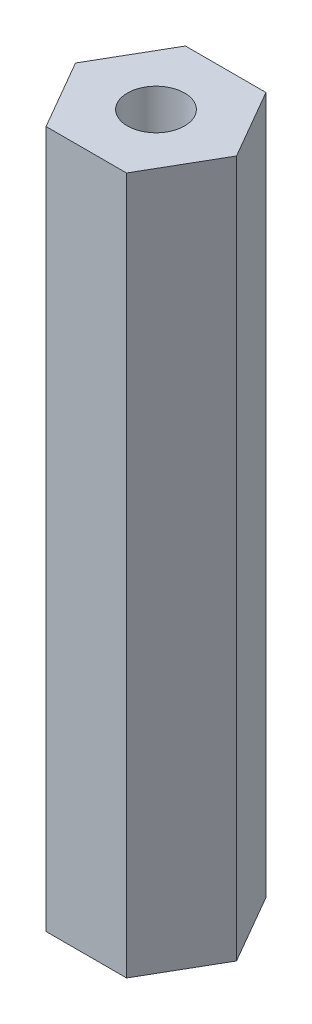
ISO-10303-21;
HEADER;
FILE_DESCRIPTION(('STEP AP214'),'2;1');
FILE_NAME('part.step','',(''),(''),'','','');
FILE_SCHEMA(('AUTOMOTIVE_DESIGN { 1 0 10303 214 1 1 1 1 }'));
ENDSEC;
DATA;
#1=APPLICATION_CONTEXT('core data for automotive mechanical design processes');
#2=APPLICATION_PROTOCOL_DEFINITION('international standard','automotive_design',2000,#1);
#3=PRODUCT_CONTEXT('',#1,'mechanical');
#4=PRODUCT('Part','Part','',(#3));
#5=PRODUCT_RELATED_PRODUCT_CATEGORY('part','',(#4));
#6=PRODUCT_DEFINITION_FORMATION('','',#4);
#7=PRODUCT_DEFINITION_CONTEXT('part definition',#1,'design');
#8=PRODUCT_DEFINITION('design','',#6,#7);
#9=PRODUCT_DEFINITION_SHAPE('','',#8);
#10=(LENGTH_UNIT() NAMED_UNIT(*) SI_UNIT(.MILLI.,.METRE.));
#11=(NAMED_UNIT(*) PLANE_ANGLE_UNIT() SI_UNIT($,.RADIAN.));
#12=(NAMED_UNIT(*) SI_UNIT($,.STERADIAN.) SOLID_ANGLE_UNIT());
#13=UNCERTAINTY_MEASURE_WITH_UNIT(LENGTH_MEASURE(1.E-05),#10,'distance_accuracy_value','');
#14=(GEOMETRIC_REPRESENTATION_CONTEXT(3) GLOBAL_UNCERTAINTY_ASSIGNED_CONTEXT((#13)) GLOBAL_UNIT_ASSIGNED_CONTEXT((#10,
#11,#12)) REPRESENTATION_CONTEXT('',''));
#15=CARTESIAN_POINT('',(0.,0.,0.));
#16=DIRECTION('',(0.,0.,1.));
#17=DIRECTION('',(1.,0.,0.));
#18=AXIS2_PLACEMENT_3D('',#15,#16,#17);
#19=CARTESIAN_POINT('',(-2.88675134592777,25.,4.16996623862909E-11));
#20=DIRECTION('',(-0.866025403784439,0.,-0.5));
#21=DIRECTION('',(-0.5,0.,0.866025403784439));
#22=AXIS2_PLACEMENT_3D('',#19,#20,#21);
#23=PLANE('',#22);
#24=DIRECTION('',(0.5,0.,-0.866025403784439));
#25=VECTOR('',#24,1.);
#26=CARTESIAN_POINT('',(-2.88675134592777,0.,4.16996623862909E-11));
#27=LINE('',#26,#25);
#28=CARTESIAN_POINT('',(-2.88675134592777,0.,4.16996623862909E-11));
#29=VERTEX_POINT('',#28);
#30=CARTESIAN_POINT('',(-1.44337567294723,0.,-2.49999999996953));
#31=VERTEX_POINT('',#30);
#32=EDGE_CURVE('E130',#29,#31,#27,.T.);
#33=ORIENTED_EDGE('',*,*,#32,.F.);
#34=DIRECTION('',(0.,-1.,0.));
#35=VECTOR('',#34,1.);
#36=CARTESIAN_POINT('',(-2.88675134592777,25.,4.16996623862909E-11));
#37=LINE('',#36,#35);
#38=CARTESIAN_POINT('',(-2.88675134592777,25.,4.16996623862909E-11));
#39=VERTEX_POINT('',#38);
#40=EDGE_CURVE('E11',#39,#29,#37,.T.);
#41=ORIENTED_EDGE('',*,*,#40,.F.);
#42=DIRECTION('',(0.5,0.,-0.866025403784439));
#43=VECTOR('',#42,1.);
#44=CARTESIAN_POINT('',(-2.88675134592777,25.,4.16996623862909E-11));
#45=LINE('',#44,#43);
#46=CARTESIAN_POINT('',(-1.44337567294723,25.,-2.49999999996953));
#47=VERTEX_POINT('',#46);
#48=EDGE_CURVE('E151',#39,#47,#45,.T.);
#49=ORIENTED_EDGE('',*,*,#48,.T.);
#50=DIRECTION('',(0.,-1.,0.));
#51=VECTOR('',#50,1.);
#52=CARTESIAN_POINT('',(-1.44337567294723,25.,-2.49999999996953));
#53=LINE('',#52,#51);
#54=EDGE_CURVE('E42',#47,#31,#53,.T.);
#55=ORIENTED_EDGE('',*,*,#54,.T.);
#56=EDGE_LOOP('',(#33,#41,#49,#55));
#57=FACE_BOUND('',#56,.T.);
#58=ADVANCED_FACE('F39',(#57),#23,.T.);
#59=CARTESIAN_POINT('',(-1.44337567298334,25.,2.49999999999038));
#60=DIRECTION('',(-0.866025403784438,0.,0.5));
#61=DIRECTION('',(0.5,0.,0.866025403784439));
#62=AXIS2_PLACEMENT_3D('',#59,#60,#61);
#63=PLANE('',#62);
#64=DIRECTION('',(-0.5,0.,-0.866025403784438));
#65=VECTOR('',#64,1.);
#66=CARTESIAN_POINT('',(-1.44337567298334,0.,2.49999999999038));
#67=LINE('',#66,#65);
#68=CARTESIAN_POINT('',(-1.44337567298334,0.,2.49999999999038));
#69=VERTEX_POINT('',#68);
#70=EDGE_CURVE('E148',#69,#29,#67,.T.);
#71=ORIENTED_EDGE('',*,*,#70,.F.);
#72=DIRECTION('',(0.,-1.,0.));
#73=VECTOR('',#72,1.);
#74=CARTESIAN_POINT('',(-1.44337567298334,25.,2.49999999999038));
#75=LINE('',#74,#73);
#76=CARTESIAN_POINT('',(-1.44337567298334,25.,2.49999999999038));
#77=VERTEX_POINT('',#76);
#78=EDGE_CURVE('E49',#77,#69,#75,.T.);
#79=ORIENTED_EDGE('',*,*,#78,.F.);
#80=DIRECTION('',(-0.5,0.,-0.866025403784438));
#81=VECTOR('',#80,1.);
#82=CARTESIAN_POINT('',(-1.44337567298334,25.,2.49999999999038));
#83=LINE('',#82,#81);
#84=EDGE_CURVE('E116',#77,#39,#83,.T.);
#85=ORIENTED_EDGE('',*,*,#84,.T.);
#86=ORIENTED_EDGE('',*,*,#40,.T.);
#87=EDGE_LOOP('',(#71,#79,#85,#86));
#88=FACE_BOUND('',#87,.T.);
#89=ADVANCED_FACE('F163',(#88),#63,.T.);
#90=CARTESIAN_POINT('',(1.44337567308889,25.,2.49999999999038));
#91=DIRECTION('',(0.,0.,1.));
#92=DIRECTION('',(1.,0.,0.));
#93=AXIS2_PLACEMENT_3D('',#90,#91,#92);
#94=PLANE('',#93);
#95=DIRECTION('',(-1.,0.,0.));
#96=VECTOR('',#95,1.);
#97=CARTESIAN_POINT('',(1.44337567308889,0.,2.49999999999038));
#98=LINE('',#97,#96);
#99=CARTESIAN_POINT('',(1.44337567308889,0.,2.49999999999038));
#100=VERTEX_POINT('',#99);
#101=EDGE_CURVE('E102',#100,#69,#98,.T.);
#102=ORIENTED_EDGE('',*,*,#101,.F.);
#103=DIRECTION('',(0.,-1.,0.));
#104=VECTOR('',#103,1.);
#105=CARTESIAN_POINT('',(1.44337567308889,25.,2.49999999999038));
#106=LINE('',#105,#104);
#107=CARTESIAN_POINT('',(1.44337567308889,25.,2.49999999999038));
#108=VERTEX_POINT('',#107);
#109=EDGE_CURVE('E97',#108,#100,#106,.T.);
#110=ORIENTED_EDGE('',*,*,#109,.F.);
#111=DIRECTION('',(-1.,0.,0.));
#112=VECTOR('',#111,1.);
#113=CARTESIAN_POINT('',(1.44337567308889,25.,2.49999999999038));
#114=LINE('',#113,#112);
#115=EDGE_CURVE('E100',#108,#77,#114,.T.);
#116=ORIENTED_EDGE('',*,*,#115,.T.);
#117=ORIENTED_EDGE('',*,*,#78,.T.);
#118=EDGE_LOOP('',(#102,#110,#116,#117));
#119=FACE_BOUND('',#118,.T.);
#120=ADVANCED_FACE('F99',(#119),#94,.T.);
#121=CARTESIAN_POINT('',(2.88675134603332,25.,-8.33997042433421E-11));
#122=DIRECTION('',(0.866025403795273,0.,0.499999999981235));
#123=DIRECTION('',(0.499999999981235,0.,-0.866025403795273));
#124=AXIS2_PLACEMENT_3D('',#121,#122,#123);
#125=PLANE('',#124);
#126=DIRECTION('',(-0.499999999981235,0.,0.866025403795273));
#127=VECTOR('',#126,1.);
#128=CARTESIAN_POINT('',(2.88675134603332,0.,-8.33997042433421E-11));
#129=LINE('',#128,#127);
#130=CARTESIAN_POINT('',(2.88675134603332,0.,-8.33997042433421E-11));
#131=VERTEX_POINT('',#130);
#132=EDGE_CURVE('E143',#131,#100,#129,.T.);
#133=ORIENTED_EDGE('',*,*,#132,.F.);
#134=DIRECTION('',(0.,-1.,0.));
#135=VECTOR('',#134,1.);
#136=CARTESIAN_POINT('',(2.88675134603332,25.,-8.33997042433421E-11));
#137=LINE('',#136,#135);
#138=CARTESIAN_POINT('',(2.88675134603332,25.,-8.33997042433421E-11));
#139=VERTEX_POINT('',#138);
#140=EDGE_CURVE('E108',#139,#131,#137,.T.);
#141=ORIENTED_EDGE('',*,*,#140,.F.);
#142=DIRECTION('',(-0.499999999981235,0.,0.866025403795273));
#143=VECTOR('',#142,1.);
#144=CARTESIAN_POINT('',(2.88675134603332,25.,-8.33997042433421E-11));
#145=LINE('',#144,#143);
#146=EDGE_CURVE('E114',#139,#108,#145,.T.);
#147=ORIENTED_EDGE('',*,*,#146,.T.);
#148=ORIENTED_EDGE('',*,*,#109,.T.);
#149=EDGE_LOOP('',(#133,#141,#147,#148));
#150=FACE_BOUND('',#149,.T.);
#151=ADVANCED_FACE('F119',(#150),#125,.T.);
#152=CARTESIAN_POINT('',(1.443375673125,25.,-2.49999999996953));
#153=DIRECTION('',(0.866025403784439,0.,-0.5));
#154=DIRECTION('',(-0.5,0.,-0.866025403784439));
#155=AXIS2_PLACEMENT_3D('',#152,#153,#154);
#156=PLANE('',#155);
#157=DIRECTION('',(0.5,0.,0.866025403784439));
#158=VECTOR('',#157,1.);
#159=CARTESIAN_POINT('',(1.443375673125,0.,-2.49999999996953));
#160=LINE('',#159,#158);
#161=CARTESIAN_POINT('',(1.443375673125,0.,-2.49999999996953));
#162=VERTEX_POINT('',#161);
#163=EDGE_CURVE('E139',#162,#131,#160,.T.);
#164=ORIENTED_EDGE('',*,*,#163,.F.);
#165=DIRECTION('',(0.,-1.,0.));
#166=VECTOR('',#165,1.);
#167=CARTESIAN_POINT('',(1.443375673125,25.,-2.49999999996953));
#168=LINE('',#167,#166);
#169=CARTESIAN_POINT('',(1.443375673125,25.,-2.49999999996953));
#170=VERTEX_POINT('',#169);
#171=EDGE_CURVE('E156',#170,#162,#168,.T.);
#172=ORIENTED_EDGE('',*,*,#171,.F.);
#173=DIRECTION('',(0.5,0.,0.866025403784439));
#174=VECTOR('',#173,1.);
#175=CARTESIAN_POINT('',(1.443375673125,25.,-2.49999999996953));
#176=LINE('',#175,#174);
#177=EDGE_CURVE('E121',#170,#139,#176,.T.);
#178=ORIENTED_EDGE('',*,*,#177,.T.);
#179=ORIENTED_EDGE('',*,*,#140,.T.);
#180=EDGE_LOOP('',(#164,#172,#178,#179));
#181=FACE_BOUND('',#180,.T.);
#182=ADVANCED_FACE('F176',(#181),#156,.T.);
#183=CARTESIAN_POINT('',(-1.44337567294723,25.,-2.49999999996953));
#184=DIRECTION('',(0.,0.,-1.));
#185=DIRECTION('',(-1.,0.,0.));
#186=AXIS2_PLACEMENT_3D('',#183,#184,#185);
#187=PLANE('',#186);
#188=DIRECTION('',(1.,0.,0.));
#189=VECTOR('',#188,1.);
#190=CARTESIAN_POINT('',(-1.44337567294723,0.,-2.49999999996953));
#191=LINE('',#190,#189);
#192=EDGE_CURVE('E134',#31,#162,#191,.T.);
#193=ORIENTED_EDGE('',*,*,#192,.F.);
#194=ORIENTED_EDGE('',*,*,#54,.F.);
#195=DIRECTION('',(1.,0.,0.));
#196=VECTOR('',#195,1.);
#197=CARTESIAN_POINT('',(-1.44337567294723,25.,-2.49999999996953));
#198=LINE('',#197,#196);
#199=EDGE_CURVE('E124',#47,#170,#198,.T.);
#200=ORIENTED_EDGE('',*,*,#199,.T.);
#201=ORIENTED_EDGE('',*,*,#171,.T.);
#202=EDGE_LOOP('',(#193,#194,#200,#201));
#203=FACE_BOUND('',#202,.T.);
#204=ADVANCED_FACE('F160',(#203),#187,.T.);
#205=CARTESIAN_POINT('',(0.,25.,0.));
#206=DIRECTION('',(0.,-1.,0.));
#207=DIRECTION('',(0.,0.,-1.));
#208=AXIS2_PLACEMENT_3D('',#205,#206,#207);
#209=PLANE('',#208);
#210=CARTESIAN_POINT('',(0.,25.,0.));
#211=DIRECTION('',(0.,-1.,0.));
#212=DIRECTION('',(0.,0.,1.));
#213=AXIS2_PLACEMENT_3D('',#210,#211,#212);
#214=CIRCLE('',#213,1.025);
#215=CARTESIAN_POINT('',(0.,25.,1.025));
#216=VERTEX_POINT('',#215);
#217=EDGE_CURVE('E135',#216,#216,#214,.T.);
#218=ORIENTED_EDGE('',*,*,#217,.T.);
#219=EDGE_LOOP('',(#218));
#220=FACE_BOUND('',#219,.T.);
#221=ORIENTED_EDGE('',*,*,#48,.F.);
#222=ORIENTED_EDGE('',*,*,#84,.F.);
#223=ORIENTED_EDGE('',*,*,#115,.F.);
#224=ORIENTED_EDGE('',*,*,#146,.F.);
#225=ORIENTED_EDGE('',*,*,#177,.F.);
#226=ORIENTED_EDGE('',*,*,#199,.F.);
#227=EDGE_LOOP('',(#221,#222,#223,#224,#225,#226));
#228=FACE_BOUND('',#227,.T.);
#229=ADVANCED_FACE('F112',(#220,#228),#209,.F.);
#230=CARTESIAN_POINT('',(0.,0.,0.));
#231=DIRECTION('',(0.,-1.,0.));
#232=DIRECTION('',(0.,0.,-1.));
#233=AXIS2_PLACEMENT_3D('',#230,#231,#232);
#234=PLANE('',#233);
#235=CARTESIAN_POINT('',(0.,0.,0.));
#236=DIRECTION('',(0.,-1.,0.));
#237=DIRECTION('',(0.,0.,1.));
#238=AXIS2_PLACEMENT_3D('',#235,#236,#237);
#239=CIRCLE('',#238,1.025);
#240=CARTESIAN_POINT('',(0.,0.,1.025));
#241=VERTEX_POINT('',#240);
#242=EDGE_CURVE('E199',#241,#241,#239,.T.);
#243=ORIENTED_EDGE('',*,*,#242,.F.);
#244=EDGE_LOOP('',(#243));
#245=FACE_BOUND('',#244,.T.);
#246=ORIENTED_EDGE('',*,*,#32,.T.);
#247=ORIENTED_EDGE('',*,*,#192,.T.);
#248=ORIENTED_EDGE('',*,*,#163,.T.);
#249=ORIENTED_EDGE('',*,*,#132,.T.);
#250=ORIENTED_EDGE('',*,*,#101,.T.);
#251=ORIENTED_EDGE('',*,*,#70,.T.);
#252=EDGE_LOOP('',(#246,#247,#248,#249,#250,#251));
#253=FACE_BOUND('',#252,.T.);
#254=ADVANCED_FACE('F162',(#245,#253),#234,.T.);
#255=CARTESIAN_POINT('',(0.,25.,0.));
#256=DIRECTION('',(0.,-1.,0.));
#257=DIRECTION('',(0.,0.,-1.));
#258=AXIS2_PLACEMENT_3D('',#255,#256,#257);
#259=CYLINDRICAL_SURFACE('',#258,1.025);
#260=ORIENTED_EDGE('',*,*,#217,.F.);
#261=EDGE_LOOP('',(#260));
#262=FACE_BOUND('',#261,.T.);
#263=ORIENTED_EDGE('',*,*,#242,.T.);
#264=EDGE_LOOP('',(#263));
#265=FACE_BOUND('',#264,.T.);
#266=ADVANCED_FACE('F187',(#262,#265),#259,.F.);
#267=CLOSED_SHELL('',(#58,#89,#120,#151,#182,#204,#229,#254,#266));
#268=MANIFOLD_SOLID_BREP('B2',#267);
#269=ADVANCED_BREP_SHAPE_REPRESENTATION('',(#18,#268),#14);
#270=SHAPE_DEFINITION_REPRESENTATION(#9,#269);
ENDSEC;
END-ISO-10303-21;
